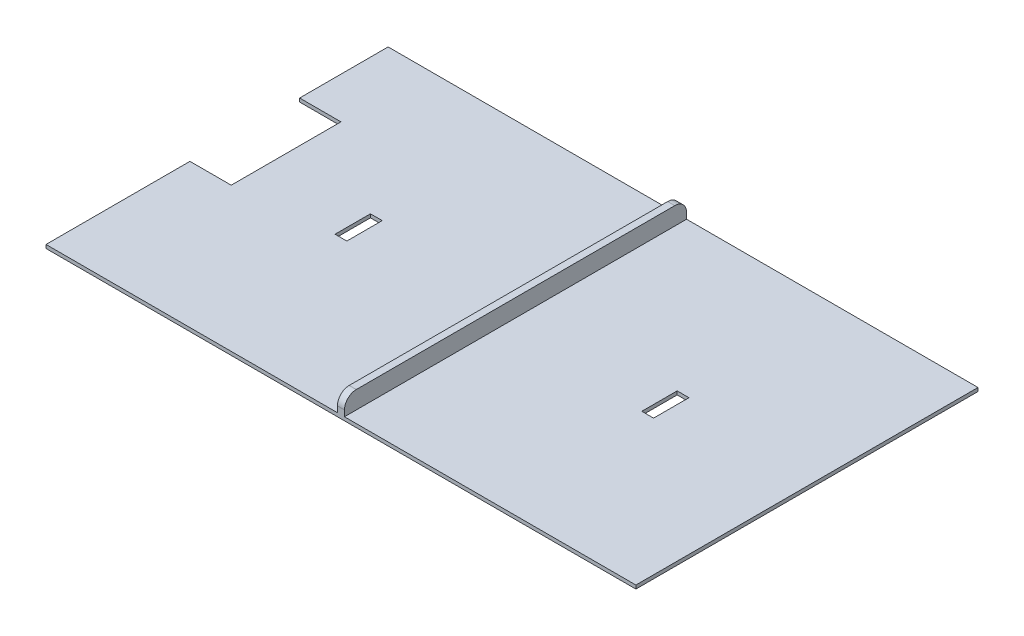
ISO-10303-21;
HEADER;
FILE_DESCRIPTION(('STEP AP214'),'2;1');
FILE_NAME('part.step','',(''),(''),'','','');
FILE_SCHEMA(('AUTOMOTIVE_DESIGN { 1 0 10303 214 1 1 1 1 }'));
ENDSEC;
DATA;
#1=APPLICATION_CONTEXT('core data for automotive mechanical design processes');
#2=APPLICATION_PROTOCOL_DEFINITION('international standard','automotive_design',2000,#1);
#3=PRODUCT_CONTEXT('',#1,'mechanical');
#4=PRODUCT('Part','Part','',(#3));
#5=PRODUCT_RELATED_PRODUCT_CATEGORY('part','',(#4));
#6=PRODUCT_DEFINITION_FORMATION('','',#4);
#7=PRODUCT_DEFINITION_CONTEXT('part definition',#1,'design');
#8=PRODUCT_DEFINITION('design','',#6,#7);
#9=PRODUCT_DEFINITION_SHAPE('','',#8);
#10=(LENGTH_UNIT() NAMED_UNIT(*) SI_UNIT(.MILLI.,.METRE.));
#11=(NAMED_UNIT(*) PLANE_ANGLE_UNIT() SI_UNIT($,.RADIAN.));
#12=(NAMED_UNIT(*) SI_UNIT($,.STERADIAN.) SOLID_ANGLE_UNIT());
#13=UNCERTAINTY_MEASURE_WITH_UNIT(LENGTH_MEASURE(1.E-05),#10,'distance_accuracy_value','');
#14=(GEOMETRIC_REPRESENTATION_CONTEXT(3) GLOBAL_UNCERTAINTY_ASSIGNED_CONTEXT((#13)) GLOBAL_UNIT_ASSIGNED_CONTEXT((#10,
#11,#12)) REPRESENTATION_CONTEXT('',''));
#15=CARTESIAN_POINT('',(0.,0.,0.));
#16=DIRECTION('',(0.,0.,1.));
#17=DIRECTION('',(1.,0.,0.));
#18=AXIS2_PLACEMENT_3D('',#15,#16,#17);
#19=CARTESIAN_POINT('',(0.,3.,0.));
#20=DIRECTION('',(0.,-1.,0.));
#21=DIRECTION('',(0.,0.,-1.));
#22=AXIS2_PLACEMENT_3D('',#19,#20,#21);
#23=PLANE('',#22);
#24=DIRECTION('',(0.,0.,1.));
#25=VECTOR('',#24,1.);
#26=CARTESIAN_POINT('',(125.,3.,15.));
#27=LINE('',#26,#25);
#28=CARTESIAN_POINT('',(125.,3.,-15.));
#29=VERTEX_POINT('',#28);
#30=CARTESIAN_POINT('',(125.,3.,15.));
#31=VERTEX_POINT('',#30);
#32=EDGE_CURVE('E241',#29,#31,#27,.T.);
#33=ORIENTED_EDGE('',*,*,#32,.F.);
#34=DIRECTION('',(-1.,0.,0.));
#35=VECTOR('',#34,1.);
#36=CARTESIAN_POINT('',(125.,3.,-15.));
#37=LINE('',#36,#35);
#38=CARTESIAN_POINT('',(135.,3.,-15.));
#39=VERTEX_POINT('',#38);
#40=EDGE_CURVE('E245',#39,#29,#37,.T.);
#41=ORIENTED_EDGE('',*,*,#40,.F.);
#42=DIRECTION('',(0.,0.,-1.));
#43=VECTOR('',#42,1.);
#44=CARTESIAN_POINT('',(135.,3.,14.9999999999999));
#45=LINE('',#44,#43);
#46=CARTESIAN_POINT('',(135.,3.,14.9999999999999));
#47=VERTEX_POINT('',#46);
#48=EDGE_CURVE('E249',#47,#39,#45,.T.);
#49=ORIENTED_EDGE('',*,*,#48,.F.);
#50=DIRECTION('',(1.,0.,0.));
#51=VECTOR('',#50,1.);
#52=CARTESIAN_POINT('',(125.,3.,15.));
#53=LINE('',#52,#51);
#54=EDGE_CURVE('E237',#31,#47,#53,.T.);
#55=ORIENTED_EDGE('',*,*,#54,.F.);
#56=EDGE_LOOP('',(#33,#41,#49,#55));
#57=FACE_BOUND('',#56,.T.);
#58=DIRECTION('',(0.,0.,-1.));
#59=VECTOR('',#58,1.);
#60=CARTESIAN_POINT('',(3.,3.,-145.));
#61=LINE('',#60,#59);
#62=CARTESIAN_POINT('',(3.,3.,145.));
#63=VERTEX_POINT('',#62);
#64=CARTESIAN_POINT('',(3.,3.,-145.));
#65=VERTEX_POINT('',#64);
#66=EDGE_CURVE('E218',#63,#65,#61,.T.);
#67=ORIENTED_EDGE('',*,*,#66,.F.);
#68=DIRECTION('',(1.,0.,0.));
#69=VECTOR('',#68,1.);
#70=CARTESIAN_POINT('',(-250.,3.,145.));
#71=LINE('',#70,#69);
#72=CARTESIAN_POINT('',(250.,3.,145.));
#73=VERTEX_POINT('',#72);
#74=EDGE_CURVE('E212',#63,#73,#71,.T.);
#75=ORIENTED_EDGE('',*,*,#74,.T.);
#76=DIRECTION('',(0.,0.,-1.));
#77=VECTOR('',#76,1.);
#78=CARTESIAN_POINT('',(250.,3.,145.));
#79=LINE('',#78,#77);
#80=CARTESIAN_POINT('',(250.,3.,-145.));
#81=VERTEX_POINT('',#80);
#82=EDGE_CURVE('E325',#73,#81,#79,.T.);
#83=ORIENTED_EDGE('',*,*,#82,.T.);
#84=DIRECTION('',(-1.,0.,0.));
#85=VECTOR('',#84,1.);
#86=CARTESIAN_POINT('',(-250.,3.,-145.));
#87=LINE('',#86,#85);
#88=EDGE_CURVE('E331',#81,#65,#87,.T.);
#89=ORIENTED_EDGE('',*,*,#88,.T.);
#90=EDGE_LOOP('',(#67,#75,#83,#89));
#91=FACE_BOUND('',#90,.T.);
#92=ADVANCED_FACE('F39',(#57,#91),#23,.F.);
#93=DIRECTION('',(0.,0.,1.));
#94=VECTOR('',#93,1.);
#95=CARTESIAN_POINT('',(-135.,3.,15.));
#96=LINE('',#95,#94);
#97=CARTESIAN_POINT('',(-135.,3.,-15.));
#98=VERTEX_POINT('',#97);
#99=CARTESIAN_POINT('',(-135.,3.,15.));
#100=VERTEX_POINT('',#99);
#101=EDGE_CURVE('E287',#98,#100,#96,.T.);
#102=ORIENTED_EDGE('',*,*,#101,.F.);
#103=DIRECTION('',(-1.,0.,0.));
#104=VECTOR('',#103,1.);
#105=CARTESIAN_POINT('',(-135.,3.,-15.));
#106=LINE('',#105,#104);
#107=CARTESIAN_POINT('',(-125.,3.,-15.));
#108=VERTEX_POINT('',#107);
#109=EDGE_CURVE('E291',#108,#98,#106,.T.);
#110=ORIENTED_EDGE('',*,*,#109,.F.);
#111=DIRECTION('',(0.,0.,-1.));
#112=VECTOR('',#111,1.);
#113=CARTESIAN_POINT('',(-125.,3.,15.));
#114=LINE('',#113,#112);
#115=CARTESIAN_POINT('',(-125.,3.,15.));
#116=VERTEX_POINT('',#115);
#117=EDGE_CURVE('E236',#116,#108,#114,.T.);
#118=ORIENTED_EDGE('',*,*,#117,.F.);
#119=DIRECTION('',(1.,0.,0.));
#120=VECTOR('',#119,1.);
#121=CARTESIAN_POINT('',(-135.,3.,15.));
#122=LINE('',#121,#120);
#123=EDGE_CURVE('E283',#100,#116,#122,.T.);
#124=ORIENTED_EDGE('',*,*,#123,.F.);
#125=EDGE_LOOP('',(#102,#110,#118,#124));
#126=FACE_BOUND('',#125,.T.);
#127=DIRECTION('',(0.,0.,1.));
#128=VECTOR('',#127,1.);
#129=CARTESIAN_POINT('',(-3.,3.,-145.));
#130=LINE('',#129,#128);
#131=CARTESIAN_POINT('',(-3.,3.,-145.));
#132=VERTEX_POINT('',#131);
#133=CARTESIAN_POINT('',(-3.,3.,145.));
#134=VERTEX_POINT('',#133);
#135=EDGE_CURVE('E205',#132,#134,#130,.T.);
#136=ORIENTED_EDGE('',*,*,#135,.F.);
#137=CARTESIAN_POINT('',(-250.,3.,-145.));
#138=VERTEX_POINT('',#137);
#139=EDGE_CURVE('E329',#132,#138,#87,.T.);
#140=ORIENTED_EDGE('',*,*,#139,.T.);
#141=DIRECTION('',(0.,0.,1.));
#142=VECTOR('',#141,1.);
#143=CARTESIAN_POINT('',(-250.,3.,-69.9999999999929));
#144=LINE('',#143,#142);
#145=CARTESIAN_POINT('',(-250.,3.,-69.9999999999929));
#146=VERTEX_POINT('',#145);
#147=EDGE_CURVE('E335',#138,#146,#144,.T.);
#148=ORIENTED_EDGE('',*,*,#147,.T.);
#149=DIRECTION('',(1.,0.,0.));
#150=VECTOR('',#149,1.);
#151=CARTESIAN_POINT('',(-250.,3.,-69.9999999999929));
#152=LINE('',#151,#150);
#153=CARTESIAN_POINT('',(-215.,3.,-69.9999999999929));
#154=VERTEX_POINT('',#153);
#155=EDGE_CURVE('E338',#146,#154,#152,.T.);
#156=ORIENTED_EDGE('',*,*,#155,.T.);
#157=DIRECTION('',(0.,0.,1.));
#158=VECTOR('',#157,1.);
#159=CARTESIAN_POINT('',(-215.,3.,-69.9999999999929));
#160=LINE('',#159,#158);
#161=CARTESIAN_POINT('',(-215.,3.,23.));
#162=VERTEX_POINT('',#161);
#163=EDGE_CURVE('E341',#154,#162,#160,.T.);
#164=ORIENTED_EDGE('',*,*,#163,.T.);
#165=DIRECTION('',(-1.,0.,0.));
#166=VECTOR('',#165,1.);
#167=CARTESIAN_POINT('',(-215.,3.,23.));
#168=LINE('',#167,#166);
#169=CARTESIAN_POINT('',(-250.,3.,23.));
#170=VERTEX_POINT('',#169);
#171=EDGE_CURVE('E344',#162,#170,#168,.T.);
#172=ORIENTED_EDGE('',*,*,#171,.T.);
#173=DIRECTION('',(0.,0.,1.));
#174=VECTOR('',#173,1.);
#175=CARTESIAN_POINT('',(-250.,3.,145.));
#176=LINE('',#175,#174);
#177=CARTESIAN_POINT('',(-250.,3.,145.));
#178=VERTEX_POINT('',#177);
#179=EDGE_CURVE('E208',#170,#178,#176,.T.);
#180=ORIENTED_EDGE('',*,*,#179,.T.);
#181=EDGE_CURVE('E193',#178,#134,#71,.T.);
#182=ORIENTED_EDGE('',*,*,#181,.T.);
#183=EDGE_LOOP('',(#136,#140,#148,#156,#164,#172,#180,#182));
#184=FACE_BOUND('',#183,.T.);
#185=ADVANCED_FACE('F204',(#126,#184),#23,.F.);
#186=CARTESIAN_POINT('',(250.,3.,145.));
#187=DIRECTION('',(-1.,0.,0.));
#188=DIRECTION('',(0.,0.,1.));
#189=AXIS2_PLACEMENT_3D('',#186,#187,#188);
#190=PLANE('',#189);
#191=DIRECTION('',(0.,0.,-1.));
#192=VECTOR('',#191,1.);
#193=CARTESIAN_POINT('',(250.,0.,145.));
#194=LINE('',#193,#192);
#195=CARTESIAN_POINT('',(250.,0.,145.));
#196=VERTEX_POINT('',#195);
#197=CARTESIAN_POINT('',(250.,0.,-145.));
#198=VERTEX_POINT('',#197);
#199=EDGE_CURVE('E282',#196,#198,#194,.T.);
#200=ORIENTED_EDGE('',*,*,#199,.T.);
#201=DIRECTION('',(0.,-1.,0.));
#202=VECTOR('',#201,1.);
#203=CARTESIAN_POINT('',(250.,3.,-145.));
#204=LINE('',#203,#202);
#205=EDGE_CURVE('E398',#81,#198,#204,.T.);
#206=ORIENTED_EDGE('',*,*,#205,.F.);
#207=ORIENTED_EDGE('',*,*,#82,.F.);
#208=DIRECTION('',(0.,-1.,0.));
#209=VECTOR('',#208,1.);
#210=CARTESIAN_POINT('',(250.,3.,145.));
#211=LINE('',#210,#209);
#212=EDGE_CURVE('E211',#73,#196,#211,.T.);
#213=ORIENTED_EDGE('',*,*,#212,.T.);
#214=EDGE_LOOP('',(#200,#206,#207,#213));
#215=FACE_BOUND('',#214,.T.);
#216=ADVANCED_FACE('F445',(#215),#190,.F.);
#217=CARTESIAN_POINT('',(-250.,3.,-145.));
#218=DIRECTION('',(0.,0.,1.));
#219=DIRECTION('',(1.,0.,0.));
#220=AXIS2_PLACEMENT_3D('',#217,#218,#219);
#221=PLANE('',#220);
#222=DIRECTION('',(0.,-1.,0.));
#223=VECTOR('',#222,1.);
#224=CARTESIAN_POINT('',(-3.,18.,-145.));
#225=LINE('',#224,#223);
#226=CARTESIAN_POINT('',(-3.,8.,-145.));
#227=VERTEX_POINT('',#226);
#228=EDGE_CURVE('E199',#227,#132,#225,.T.);
#229=ORIENTED_EDGE('',*,*,#228,.F.);
#230=DIRECTION('',(-1.,0.,0.));
#231=VECTOR('',#230,1.);
#232=CARTESIAN_POINT('',(3.,8.,-145.));
#233=LINE('',#232,#231);
#234=CARTESIAN_POINT('',(3.,8.,-145.));
#235=VERTEX_POINT('',#234);
#236=EDGE_CURVE('E63',#227,#235,#233,.F.);
#237=ORIENTED_EDGE('',*,*,#236,.T.);
#238=DIRECTION('',(0.,-1.,0.));
#239=VECTOR('',#238,1.);
#240=CARTESIAN_POINT('',(3.,18.,-145.));
#241=LINE('',#240,#239);
#242=EDGE_CURVE('E233',#235,#65,#241,.T.);
#243=ORIENTED_EDGE('',*,*,#242,.T.);
#244=ORIENTED_EDGE('',*,*,#88,.F.);
#245=ORIENTED_EDGE('',*,*,#205,.T.);
#246=DIRECTION('',(-1.,0.,0.));
#247=VECTOR('',#246,1.);
#248=CARTESIAN_POINT('',(-250.,0.,-145.));
#249=LINE('',#248,#247);
#250=CARTESIAN_POINT('',(-250.,0.,-145.));
#251=VERTEX_POINT('',#250);
#252=EDGE_CURVE('E352',#198,#251,#249,.T.);
#253=ORIENTED_EDGE('',*,*,#252,.T.);
#254=DIRECTION('',(0.,-1.,0.));
#255=VECTOR('',#254,1.);
#256=CARTESIAN_POINT('',(-250.,3.,-145.));
#257=LINE('',#256,#255);
#258=EDGE_CURVE('E394',#138,#251,#257,.T.);
#259=ORIENTED_EDGE('',*,*,#258,.F.);
#260=ORIENTED_EDGE('',*,*,#139,.F.);
#261=EDGE_LOOP('',(#229,#237,#243,#244,#245,#253,#259,#260));
#262=FACE_BOUND('',#261,.T.);
#263=ADVANCED_FACE('F429',(#262),#221,.F.);
#264=CARTESIAN_POINT('',(-250.,3.,-69.9999999999929));
#265=DIRECTION('',(1.,0.,0.));
#266=DIRECTION('',(0.,0.,-1.));
#267=AXIS2_PLACEMENT_3D('',#264,#265,#266);
#268=PLANE('',#267);
#269=DIRECTION('',(0.,0.,1.));
#270=VECTOR('',#269,1.);
#271=CARTESIAN_POINT('',(-250.,0.,-69.9999999999929));
#272=LINE('',#271,#270);
#273=CARTESIAN_POINT('',(-250.,0.,-69.9999999999929));
#274=VERTEX_POINT('',#273);
#275=EDGE_CURVE('E355',#251,#274,#272,.T.);
#276=ORIENTED_EDGE('',*,*,#275,.T.);
#277=DIRECTION('',(0.,-1.,0.));
#278=VECTOR('',#277,1.);
#279=CARTESIAN_POINT('',(-250.,3.,-69.9999999999929));
#280=LINE('',#279,#278);
#281=EDGE_CURVE('E390',#146,#274,#280,.T.);
#282=ORIENTED_EDGE('',*,*,#281,.F.);
#283=ORIENTED_EDGE('',*,*,#147,.F.);
#284=ORIENTED_EDGE('',*,*,#258,.T.);
#285=EDGE_LOOP('',(#276,#282,#283,#284));
#286=FACE_BOUND('',#285,.T.);
#287=ADVANCED_FACE('F474',(#286),#268,.F.);
#288=CARTESIAN_POINT('',(-250.,3.,-69.9999999999929));
#289=DIRECTION('',(0.,0.,-1.));
#290=DIRECTION('',(-1.,0.,0.));
#291=AXIS2_PLACEMENT_3D('',#288,#289,#290);
#292=PLANE('',#291);
#293=DIRECTION('',(1.,0.,0.));
#294=VECTOR('',#293,1.);
#295=CARTESIAN_POINT('',(-250.,0.,-69.9999999999929));
#296=LINE('',#295,#294);
#297=CARTESIAN_POINT('',(-215.,0.,-69.9999999999929));
#298=VERTEX_POINT('',#297);
#299=EDGE_CURVE('E358',#274,#298,#296,.T.);
#300=ORIENTED_EDGE('',*,*,#299,.T.);
#301=DIRECTION('',(0.,-1.,0.));
#302=VECTOR('',#301,1.);
#303=CARTESIAN_POINT('',(-215.,3.,-69.9999999999929));
#304=LINE('',#303,#302);
#305=EDGE_CURVE('E386',#154,#298,#304,.T.);
#306=ORIENTED_EDGE('',*,*,#305,.F.);
#307=ORIENTED_EDGE('',*,*,#155,.F.);
#308=ORIENTED_EDGE('',*,*,#281,.T.);
#309=EDGE_LOOP('',(#300,#306,#307,#308));
#310=FACE_BOUND('',#309,.T.);
#311=ADVANCED_FACE('F470',(#310),#292,.F.);
#312=CARTESIAN_POINT('',(-215.,3.,-69.9999999999929));
#313=DIRECTION('',(1.,0.,0.));
#314=DIRECTION('',(0.,0.,-1.));
#315=AXIS2_PLACEMENT_3D('',#312,#313,#314);
#316=PLANE('',#315);
#317=DIRECTION('',(0.,0.,1.));
#318=VECTOR('',#317,1.);
#319=CARTESIAN_POINT('',(-215.,0.,-69.9999999999929));
#320=LINE('',#319,#318);
#321=CARTESIAN_POINT('',(-215.,0.,23.));
#322=VERTEX_POINT('',#321);
#323=EDGE_CURVE('E361',#298,#322,#320,.T.);
#324=ORIENTED_EDGE('',*,*,#323,.T.);
#325=DIRECTION('',(0.,-1.,0.));
#326=VECTOR('',#325,1.);
#327=CARTESIAN_POINT('',(-215.,3.,23.));
#328=LINE('',#327,#326);
#329=EDGE_CURVE('E382',#162,#322,#328,.T.);
#330=ORIENTED_EDGE('',*,*,#329,.F.);
#331=ORIENTED_EDGE('',*,*,#163,.F.);
#332=ORIENTED_EDGE('',*,*,#305,.T.);
#333=EDGE_LOOP('',(#324,#330,#331,#332));
#334=FACE_BOUND('',#333,.T.);
#335=ADVANCED_FACE('F466',(#334),#316,.F.);
#336=CARTESIAN_POINT('',(-215.,3.,23.));
#337=DIRECTION('',(0.,0.,1.));
#338=DIRECTION('',(1.,0.,0.));
#339=AXIS2_PLACEMENT_3D('',#336,#337,#338);
#340=PLANE('',#339);
#341=DIRECTION('',(-1.,0.,0.));
#342=VECTOR('',#341,1.);
#343=CARTESIAN_POINT('',(-215.,0.,23.));
#344=LINE('',#343,#342);
#345=CARTESIAN_POINT('',(-250.,0.,23.));
#346=VERTEX_POINT('',#345);
#347=EDGE_CURVE('E364',#322,#346,#344,.T.);
#348=ORIENTED_EDGE('',*,*,#347,.T.);
#349=DIRECTION('',(0.,-1.,0.));
#350=VECTOR('',#349,1.);
#351=CARTESIAN_POINT('',(-250.,3.,23.));
#352=LINE('',#351,#350);
#353=EDGE_CURVE('E378',#170,#346,#352,.T.);
#354=ORIENTED_EDGE('',*,*,#353,.F.);
#355=ORIENTED_EDGE('',*,*,#171,.F.);
#356=ORIENTED_EDGE('',*,*,#329,.T.);
#357=EDGE_LOOP('',(#348,#354,#355,#356));
#358=FACE_BOUND('',#357,.T.);
#359=ADVANCED_FACE('F462',(#358),#340,.F.);
#360=CARTESIAN_POINT('',(-250.,3.,145.));
#361=DIRECTION('',(1.,0.,0.));
#362=DIRECTION('',(0.,0.,-1.));
#363=AXIS2_PLACEMENT_3D('',#360,#361,#362);
#364=PLANE('',#363);
#365=DIRECTION('',(0.,0.,1.));
#366=VECTOR('',#365,1.);
#367=CARTESIAN_POINT('',(-250.,0.,145.));
#368=LINE('',#367,#366);
#369=CARTESIAN_POINT('',(-250.,0.,145.));
#370=VERTEX_POINT('',#369);
#371=EDGE_CURVE('E367',#346,#370,#368,.T.);
#372=ORIENTED_EDGE('',*,*,#371,.T.);
#373=DIRECTION('',(0.,-1.,0.));
#374=VECTOR('',#373,1.);
#375=CARTESIAN_POINT('',(-250.,3.,145.));
#376=LINE('',#375,#374);
#377=EDGE_CURVE('E375',#178,#370,#376,.T.);
#378=ORIENTED_EDGE('',*,*,#377,.F.);
#379=ORIENTED_EDGE('',*,*,#179,.F.);
#380=ORIENTED_EDGE('',*,*,#353,.T.);
#381=EDGE_LOOP('',(#372,#378,#379,#380));
#382=FACE_BOUND('',#381,.T.);
#383=ADVANCED_FACE('F459',(#382),#364,.F.);
#384=CARTESIAN_POINT('',(-250.,3.,145.));
#385=DIRECTION('',(0.,0.,-1.));
#386=DIRECTION('',(-1.,0.,0.));
#387=AXIS2_PLACEMENT_3D('',#384,#385,#386);
#388=PLANE('',#387);
#389=DIRECTION('',(0.,-1.,0.));
#390=VECTOR('',#389,1.);
#391=CARTESIAN_POINT('',(3.,18.,145.));
#392=LINE('',#391,#390);
#393=CARTESIAN_POINT('',(3.,8.,145.));
#394=VERTEX_POINT('',#393);
#395=EDGE_CURVE('E200',#394,#63,#392,.T.);
#396=ORIENTED_EDGE('',*,*,#395,.F.);
#397=DIRECTION('',(1.,0.,0.));
#398=VECTOR('',#397,1.);
#399=CARTESIAN_POINT('',(-3.,8.,145.));
#400=LINE('',#399,#398);
#401=CARTESIAN_POINT('',(-3.,8.,145.));
#402=VERTEX_POINT('',#401);
#403=EDGE_CURVE('E11',#394,#402,#400,.F.);
#404=ORIENTED_EDGE('',*,*,#403,.T.);
#405=DIRECTION('',(0.,-1.,0.));
#406=VECTOR('',#405,1.);
#407=CARTESIAN_POINT('',(-3.,18.,145.));
#408=LINE('',#407,#406);
#409=EDGE_CURVE('E189',#402,#134,#408,.T.);
#410=ORIENTED_EDGE('',*,*,#409,.T.);
#411=ORIENTED_EDGE('',*,*,#181,.F.);
#412=ORIENTED_EDGE('',*,*,#377,.T.);
#413=DIRECTION('',(1.,0.,0.));
#414=VECTOR('',#413,1.);
#415=CARTESIAN_POINT('',(-250.,0.,145.));
#416=LINE('',#415,#414);
#417=EDGE_CURVE('E330',#370,#196,#416,.T.);
#418=ORIENTED_EDGE('',*,*,#417,.T.);
#419=ORIENTED_EDGE('',*,*,#212,.F.);
#420=ORIENTED_EDGE('',*,*,#74,.F.);
#421=EDGE_LOOP('',(#396,#404,#410,#411,#412,#418,#419,#420));
#422=FACE_BOUND('',#421,.T.);
#423=ADVANCED_FACE('F191',(#422),#388,.F.);
#424=CARTESIAN_POINT('',(0.,0.,0.));
#425=DIRECTION('',(0.,-1.,0.));
#426=DIRECTION('',(0.,0.,-1.));
#427=AXIS2_PLACEMENT_3D('',#424,#425,#426);
#428=PLANE('',#427);
#429=DIRECTION('',(-1.,0.,0.));
#430=VECTOR('',#429,1.);
#431=CARTESIAN_POINT('',(125.,0.,-15.));
#432=LINE('',#431,#430);
#433=CARTESIAN_POINT('',(135.,0.,-15.));
#434=VERTEX_POINT('',#433);
#435=CARTESIAN_POINT('',(125.,0.,-15.));
#436=VERTEX_POINT('',#435);
#437=EDGE_CURVE('E240',#434,#436,#432,.T.);
#438=ORIENTED_EDGE('',*,*,#437,.T.);
#439=DIRECTION('',(0.,0.,1.));
#440=VECTOR('',#439,1.);
#441=CARTESIAN_POINT('',(125.,0.,15.));
#442=LINE('',#441,#440);
#443=CARTESIAN_POINT('',(125.,0.,15.));
#444=VERTEX_POINT('',#443);
#445=EDGE_CURVE('E269',#436,#444,#442,.T.);
#446=ORIENTED_EDGE('',*,*,#445,.T.);
#447=DIRECTION('',(1.,0.,0.));
#448=VECTOR('',#447,1.);
#449=CARTESIAN_POINT('',(125.,0.,15.));
#450=LINE('',#449,#448);
#451=CARTESIAN_POINT('',(135.,0.,14.9999999999999));
#452=VERTEX_POINT('',#451);
#453=EDGE_CURVE('E264',#444,#452,#450,.T.);
#454=ORIENTED_EDGE('',*,*,#453,.T.);
#455=DIRECTION('',(0.,0.,-1.));
#456=VECTOR('',#455,1.);
#457=CARTESIAN_POINT('',(135.,0.,14.9999999999999));
#458=LINE('',#457,#456);
#459=EDGE_CURVE('E258',#452,#434,#458,.T.);
#460=ORIENTED_EDGE('',*,*,#459,.T.);
#461=EDGE_LOOP('',(#438,#446,#454,#460));
#462=FACE_BOUND('',#461,.T.);
#463=DIRECTION('',(-1.,0.,0.));
#464=VECTOR('',#463,1.);
#465=CARTESIAN_POINT('',(-135.,0.,-15.));
#466=LINE('',#465,#464);
#467=CARTESIAN_POINT('',(-125.,0.,-15.));
#468=VERTEX_POINT('',#467);
#469=CARTESIAN_POINT('',(-135.,0.,-15.));
#470=VERTEX_POINT('',#469);
#471=EDGE_CURVE('E286',#468,#470,#466,.T.);
#472=ORIENTED_EDGE('',*,*,#471,.T.);
#473=DIRECTION('',(0.,0.,1.));
#474=VECTOR('',#473,1.);
#475=CARTESIAN_POINT('',(-135.,0.,15.));
#476=LINE('',#475,#474);
#477=CARTESIAN_POINT('',(-135.,0.,15.));
#478=VERTEX_POINT('',#477);
#479=EDGE_CURVE('E312',#470,#478,#476,.T.);
#480=ORIENTED_EDGE('',*,*,#479,.T.);
#481=DIRECTION('',(1.,0.,0.));
#482=VECTOR('',#481,1.);
#483=CARTESIAN_POINT('',(-135.,0.,15.));
#484=LINE('',#483,#482);
#485=CARTESIAN_POINT('',(-125.,0.,15.));
#486=VERTEX_POINT('',#485);
#487=EDGE_CURVE('E307',#478,#486,#484,.T.);
#488=ORIENTED_EDGE('',*,*,#487,.T.);
#489=DIRECTION('',(0.,0.,-1.));
#490=VECTOR('',#489,1.);
#491=CARTESIAN_POINT('',(-125.,0.,15.));
#492=LINE('',#491,#490);
#493=EDGE_CURVE('E302',#486,#468,#492,.T.);
#494=ORIENTED_EDGE('',*,*,#493,.T.);
#495=EDGE_LOOP('',(#472,#480,#488,#494));
#496=FACE_BOUND('',#495,.T.);
#497=ORIENTED_EDGE('',*,*,#199,.F.);
#498=ORIENTED_EDGE('',*,*,#417,.F.);
#499=ORIENTED_EDGE('',*,*,#371,.F.);
#500=ORIENTED_EDGE('',*,*,#347,.F.);
#501=ORIENTED_EDGE('',*,*,#323,.F.);
#502=ORIENTED_EDGE('',*,*,#299,.F.);
#503=ORIENTED_EDGE('',*,*,#275,.F.);
#504=ORIENTED_EDGE('',*,*,#252,.F.);
#505=EDGE_LOOP('',(#497,#498,#499,#500,#501,#502,#503,#504));
#506=FACE_BOUND('',#505,.T.);
#507=ADVANCED_FACE('F453',(#462,#496,#506),#428,.T.);
#508=CARTESIAN_POINT('',(-135.,-31.6227766016838,-15.));
#509=DIRECTION('',(0.,0.,-1.));
#510=DIRECTION('',(-1.,0.,0.));
#511=AXIS2_PLACEMENT_3D('',#508,#509,#510);
#512=PLANE('',#511);
#513=DIRECTION('',(0.,1.,0.));
#514=VECTOR('',#513,1.);
#515=CARTESIAN_POINT('',(-125.,-31.6227766016838,-15.));
#516=LINE('',#515,#514);
#517=EDGE_CURVE('E253',#468,#108,#516,.T.);
#518=ORIENTED_EDGE('',*,*,#517,.T.);
#519=ORIENTED_EDGE('',*,*,#109,.T.);
#520=DIRECTION('',(0.,1.,0.));
#521=VECTOR('',#520,1.);
#522=CARTESIAN_POINT('',(-135.,-31.6227766016838,-15.));
#523=LINE('',#522,#521);
#524=EDGE_CURVE('E301',#470,#98,#523,.T.);
#525=ORIENTED_EDGE('',*,*,#524,.F.);
#526=ORIENTED_EDGE('',*,*,#471,.F.);
#527=EDGE_LOOP('',(#518,#519,#525,#526));
#528=FACE_BOUND('',#527,.T.);
#529=ADVANCED_FACE('F451',(#528),#512,.F.);
#530=CARTESIAN_POINT('',(-135.,-31.6227766016838,15.));
#531=DIRECTION('',(-1.,0.,0.));
#532=DIRECTION('',(0.,0.,1.));
#533=AXIS2_PLACEMENT_3D('',#530,#531,#532);
#534=PLANE('',#533);
#535=ORIENTED_EDGE('',*,*,#524,.T.);
#536=ORIENTED_EDGE('',*,*,#101,.T.);
#537=DIRECTION('',(0.,1.,0.));
#538=VECTOR('',#537,1.);
#539=CARTESIAN_POINT('',(-135.,-31.6227766016838,15.));
#540=LINE('',#539,#538);
#541=EDGE_CURVE('E311',#478,#100,#540,.T.);
#542=ORIENTED_EDGE('',*,*,#541,.F.);
#543=ORIENTED_EDGE('',*,*,#479,.F.);
#544=EDGE_LOOP('',(#535,#536,#542,#543));
#545=FACE_BOUND('',#544,.T.);
#546=ADVANCED_FACE('F547',(#545),#534,.F.);
#547=CARTESIAN_POINT('',(-135.,-31.6227766016838,15.));
#548=DIRECTION('',(0.,0.,1.));
#549=DIRECTION('',(1.,0.,0.));
#550=AXIS2_PLACEMENT_3D('',#547,#548,#549);
#551=PLANE('',#550);
#552=ORIENTED_EDGE('',*,*,#541,.T.);
#553=ORIENTED_EDGE('',*,*,#123,.T.);
#554=DIRECTION('',(0.,1.,0.));
#555=VECTOR('',#554,1.);
#556=CARTESIAN_POINT('',(-125.,-31.6227766016838,15.));
#557=LINE('',#556,#555);
#558=EDGE_CURVE('E306',#486,#116,#557,.T.);
#559=ORIENTED_EDGE('',*,*,#558,.F.);
#560=ORIENTED_EDGE('',*,*,#487,.F.);
#561=EDGE_LOOP('',(#552,#553,#559,#560));
#562=FACE_BOUND('',#561,.T.);
#563=ADVANCED_FACE('F554',(#562),#551,.F.);
#564=CARTESIAN_POINT('',(-125.,-31.6227766016838,15.));
#565=DIRECTION('',(1.,0.,0.));
#566=DIRECTION('',(0.,0.,-1.));
#567=AXIS2_PLACEMENT_3D('',#564,#565,#566);
#568=PLANE('',#567);
#569=ORIENTED_EDGE('',*,*,#558,.T.);
#570=ORIENTED_EDGE('',*,*,#117,.T.);
#571=ORIENTED_EDGE('',*,*,#517,.F.);
#572=ORIENTED_EDGE('',*,*,#493,.F.);
#573=EDGE_LOOP('',(#569,#570,#571,#572));
#574=FACE_BOUND('',#573,.T.);
#575=ADVANCED_FACE('F561',(#574),#568,.F.);
#576=CARTESIAN_POINT('',(125.,-31.6227766016838,-15.));
#577=DIRECTION('',(0.,0.,-1.));
#578=DIRECTION('',(-1.,0.,0.));
#579=AXIS2_PLACEMENT_3D('',#576,#577,#578);
#580=PLANE('',#579);
#581=DIRECTION('',(0.,1.,0.));
#582=VECTOR('',#581,1.);
#583=CARTESIAN_POINT('',(135.,-31.6227766016838,-15.));
#584=LINE('',#583,#582);
#585=EDGE_CURVE('E262',#434,#39,#584,.T.);
#586=ORIENTED_EDGE('',*,*,#585,.T.);
#587=ORIENTED_EDGE('',*,*,#40,.T.);
#588=DIRECTION('',(0.,1.,0.));
#589=VECTOR('',#588,1.);
#590=CARTESIAN_POINT('',(125.,-31.6227766016838,-15.));
#591=LINE('',#590,#589);
#592=EDGE_CURVE('E257',#436,#29,#591,.T.);
#593=ORIENTED_EDGE('',*,*,#592,.F.);
#594=ORIENTED_EDGE('',*,*,#437,.F.);
#595=EDGE_LOOP('',(#586,#587,#593,#594));
#596=FACE_BOUND('',#595,.T.);
#597=ADVANCED_FACE('F569',(#596),#580,.F.);
#598=CARTESIAN_POINT('',(125.,-31.6227766016838,15.));
#599=DIRECTION('',(-1.,0.,0.));
#600=DIRECTION('',(0.,0.,1.));
#601=AXIS2_PLACEMENT_3D('',#598,#599,#600);
#602=PLANE('',#601);
#603=ORIENTED_EDGE('',*,*,#592,.T.);
#604=ORIENTED_EDGE('',*,*,#32,.T.);
#605=DIRECTION('',(0.,1.,0.));
#606=VECTOR('',#605,1.);
#607=CARTESIAN_POINT('',(125.,-31.6227766016838,15.));
#608=LINE('',#607,#606);
#609=EDGE_CURVE('E268',#444,#31,#608,.T.);
#610=ORIENTED_EDGE('',*,*,#609,.F.);
#611=ORIENTED_EDGE('',*,*,#445,.F.);
#612=EDGE_LOOP('',(#603,#604,#610,#611));
#613=FACE_BOUND('',#612,.T.);
#614=ADVANCED_FACE('F577',(#613),#602,.F.);
#615=CARTESIAN_POINT('',(125.,-31.6227766016838,15.));
#616=DIRECTION('',(0.,0.,1.));
#617=DIRECTION('',(1.,0.,0.));
#618=AXIS2_PLACEMENT_3D('',#615,#616,#617);
#619=PLANE('',#618);
#620=ORIENTED_EDGE('',*,*,#609,.T.);
#621=ORIENTED_EDGE('',*,*,#54,.T.);
#622=DIRECTION('',(0.,1.,0.));
#623=VECTOR('',#622,1.);
#624=CARTESIAN_POINT('',(135.,-31.6227766016838,14.9999999999999));
#625=LINE('',#624,#623);
#626=EDGE_CURVE('E263',#452,#47,#625,.T.);
#627=ORIENTED_EDGE('',*,*,#626,.F.);
#628=ORIENTED_EDGE('',*,*,#453,.F.);
#629=EDGE_LOOP('',(#620,#621,#627,#628));
#630=FACE_BOUND('',#629,.T.);
#631=ADVANCED_FACE('F585',(#630),#619,.F.);
#632=CARTESIAN_POINT('',(135.,-31.6227766016838,14.9999999999999));
#633=DIRECTION('',(1.,0.,0.));
#634=DIRECTION('',(0.,0.,-1.));
#635=AXIS2_PLACEMENT_3D('',#632,#633,#634);
#636=PLANE('',#635);
#637=ORIENTED_EDGE('',*,*,#626,.T.);
#638=ORIENTED_EDGE('',*,*,#48,.T.);
#639=ORIENTED_EDGE('',*,*,#585,.F.);
#640=ORIENTED_EDGE('',*,*,#459,.F.);
#641=EDGE_LOOP('',(#637,#638,#639,#640));
#642=FACE_BOUND('',#641,.T.);
#643=ADVANCED_FACE('F593',(#642),#636,.F.);
#644=CARTESIAN_POINT('',(3.,18.,-145.));
#645=DIRECTION('',(-1.,0.,0.));
#646=DIRECTION('',(0.,0.,1.));
#647=AXIS2_PLACEMENT_3D('',#644,#645,#646);
#648=PLANE('',#647);
#649=ORIENTED_EDGE('',*,*,#242,.F.);
#650=CARTESIAN_POINT('',(3.,8.,-135.));
#651=DIRECTION('',(-1.,0.,0.));
#652=DIRECTION('',(0.,0.,1.));
#653=AXIS2_PLACEMENT_3D('',#650,#651,#652);
#654=CIRCLE('',#653,10.);
#655=CARTESIAN_POINT('',(3.,18.,-135.));
#656=VERTEX_POINT('',#655);
#657=EDGE_CURVE('E48',#235,#656,#654,.F.);
#658=ORIENTED_EDGE('',*,*,#657,.T.);
#659=DIRECTION('',(0.,0.,-1.));
#660=VECTOR('',#659,1.);
#661=CARTESIAN_POINT('',(3.,18.,-145.));
#662=LINE('',#661,#660);
#663=CARTESIAN_POINT('',(3.,18.,135.));
#664=VERTEX_POINT('',#663);
#665=EDGE_CURVE('E217',#664,#656,#662,.T.);
#666=ORIENTED_EDGE('',*,*,#665,.F.);
#667=CARTESIAN_POINT('',(3.,8.,135.));
#668=DIRECTION('',(-1.,0.,0.));
#669=DIRECTION('',(0.,0.,1.));
#670=AXIS2_PLACEMENT_3D('',#667,#668,#669);
#671=CIRCLE('',#670,10.);
#672=EDGE_CURVE('E55',#664,#394,#671,.F.);
#673=ORIENTED_EDGE('',*,*,#672,.T.);
#674=ORIENTED_EDGE('',*,*,#395,.T.);
#675=ORIENTED_EDGE('',*,*,#66,.T.);
#676=EDGE_LOOP('',(#649,#658,#666,#673,#674,#675));
#677=FACE_BOUND('',#676,.T.);
#678=ADVANCED_FACE('F421',(#677),#648,.F.);
#679=CARTESIAN_POINT('',(-3.,18.,-145.));
#680=DIRECTION('',(1.,0.,0.));
#681=DIRECTION('',(0.,0.,-1.));
#682=AXIS2_PLACEMENT_3D('',#679,#680,#681);
#683=PLANE('',#682);
#684=DIRECTION('',(0.,0.,1.));
#685=VECTOR('',#684,1.);
#686=CARTESIAN_POINT('',(-3.,18.,-145.));
#687=LINE('',#686,#685);
#688=CARTESIAN_POINT('',(-3.,18.,-135.));
#689=VERTEX_POINT('',#688);
#690=CARTESIAN_POINT('',(-3.,18.,135.));
#691=VERTEX_POINT('',#690);
#692=EDGE_CURVE('E223',#689,#691,#687,.T.);
#693=ORIENTED_EDGE('',*,*,#692,.F.);
#694=CARTESIAN_POINT('',(-3.,8.,-135.));
#695=DIRECTION('',(1.,0.,0.));
#696=DIRECTION('',(0.,0.,-1.));
#697=AXIS2_PLACEMENT_3D('',#694,#695,#696);
#698=CIRCLE('',#697,10.);
#699=EDGE_CURVE('E413',#689,#227,#698,.F.);
#700=ORIENTED_EDGE('',*,*,#699,.T.);
#701=ORIENTED_EDGE('',*,*,#228,.T.);
#702=ORIENTED_EDGE('',*,*,#135,.T.);
#703=ORIENTED_EDGE('',*,*,#409,.F.);
#704=CARTESIAN_POINT('',(-3.,8.,135.));
#705=DIRECTION('',(1.,0.,0.));
#706=DIRECTION('',(0.,0.,-1.));
#707=AXIS2_PLACEMENT_3D('',#704,#705,#706);
#708=CIRCLE('',#707,10.);
#709=EDGE_CURVE('E410',#402,#691,#708,.F.);
#710=ORIENTED_EDGE('',*,*,#709,.T.);
#711=EDGE_LOOP('',(#693,#700,#701,#702,#703,#710));
#712=FACE_BOUND('',#711,.T.);
#713=ADVANCED_FACE('F215',(#712),#683,.F.);
#714=CARTESIAN_POINT('',(0.,18.,0.));
#715=DIRECTION('',(0.,1.,0.));
#716=DIRECTION('',(0.,0.,1.));
#717=AXIS2_PLACEMENT_3D('',#714,#715,#716);
#718=PLANE('',#717);
#719=ORIENTED_EDGE('',*,*,#665,.T.);
#720=DIRECTION('',(-1.,0.,0.));
#721=VECTOR('',#720,1.);
#722=CARTESIAN_POINT('',(-3.,18.,-135.));
#723=LINE('',#722,#721);
#724=EDGE_CURVE('E406',#656,#689,#723,.T.);
#725=ORIENTED_EDGE('',*,*,#724,.T.);
#726=ORIENTED_EDGE('',*,*,#692,.T.);
#727=DIRECTION('',(1.,0.,0.));
#728=VECTOR('',#727,1.);
#729=CARTESIAN_POINT('',(3.,18.,135.));
#730=LINE('',#729,#728);
#731=EDGE_CURVE('E402',#691,#664,#730,.T.);
#732=ORIENTED_EDGE('',*,*,#731,.T.);
#733=EDGE_LOOP('',(#719,#725,#726,#732));
#734=FACE_BOUND('',#733,.T.);
#735=ADVANCED_FACE('F425',(#734),#718,.T.);
#736=CARTESIAN_POINT('',(0.,8.,-135.));
#737=DIRECTION('',(1.,0.,0.));
#738=DIRECTION('',(0.,0.,-1.));
#739=AXIS2_PLACEMENT_3D('',#736,#737,#738);
#740=CYLINDRICAL_SURFACE('',#739,10.);
#741=ORIENTED_EDGE('',*,*,#657,.F.);
#742=ORIENTED_EDGE('',*,*,#236,.F.);
#743=ORIENTED_EDGE('',*,*,#699,.F.);
#744=ORIENTED_EDGE('',*,*,#724,.F.);
#745=EDGE_LOOP('',(#741,#742,#743,#744));
#746=FACE_BOUND('',#745,.T.);
#747=ADVANCED_FACE('F428',(#746),#740,.T.);
#748=CARTESIAN_POINT('',(0.,8.,135.));
#749=DIRECTION('',(-1.,0.,0.));
#750=DIRECTION('',(0.,0.,1.));
#751=AXIS2_PLACEMENT_3D('',#748,#749,#750);
#752=CYLINDRICAL_SURFACE('',#751,10.);
#753=ORIENTED_EDGE('',*,*,#709,.F.);
#754=ORIENTED_EDGE('',*,*,#403,.F.);
#755=ORIENTED_EDGE('',*,*,#672,.F.);
#756=ORIENTED_EDGE('',*,*,#731,.F.);
#757=EDGE_LOOP('',(#753,#754,#755,#756));
#758=FACE_BOUND('',#757,.T.);
#759=ADVANCED_FACE('F41',(#758),#752,.T.);
#760=CLOSED_SHELL('',(#92,#185,#216,#263,#287,#311,#335,#359,#383,#423,#507,#529,#546,#563,#575,
#597,#614,#631,#643,#678,#713,#735,#747,#759));
#761=MANIFOLD_SOLID_BREP('B2',#760);
#762=ADVANCED_BREP_SHAPE_REPRESENTATION('',(#18,#761),#14);
#763=SHAPE_DEFINITION_REPRESENTATION(#9,#762);
ENDSEC;
END-ISO-10303-21;
